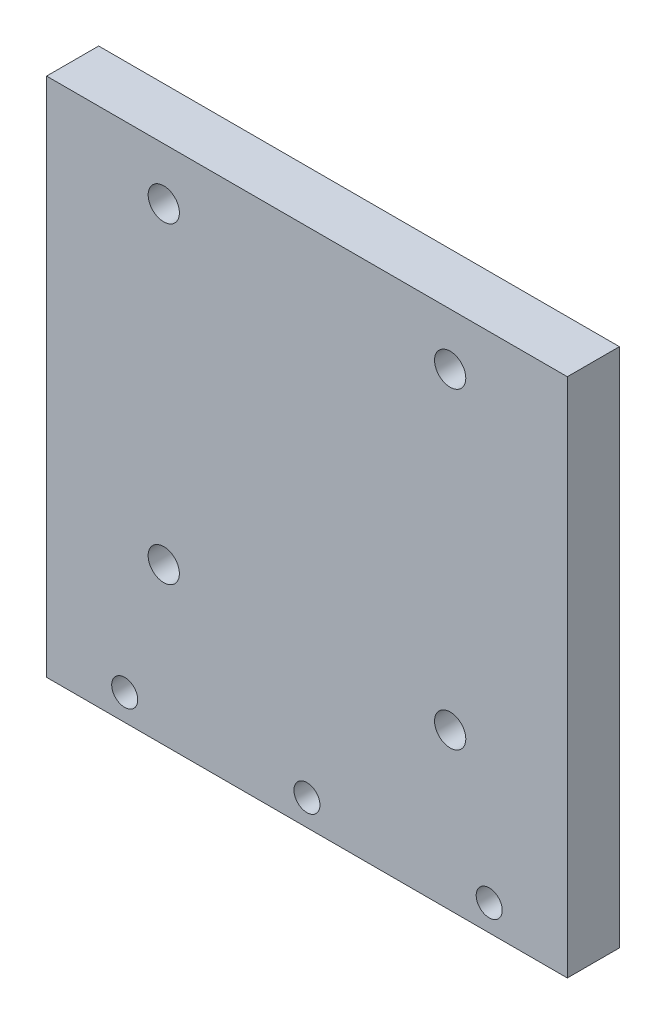
ISO-10303-21;
HEADER;
FILE_DESCRIPTION(('STEP AP214'),'2;1');
FILE_NAME('part.step','',(''),(''),'','','');
FILE_SCHEMA(('AUTOMOTIVE_DESIGN { 1 0 10303 214 1 1 1 1 }'));
ENDSEC;
DATA;
#1=APPLICATION_CONTEXT('core data for automotive mechanical design processes');
#2=APPLICATION_PROTOCOL_DEFINITION('international standard','automotive_design',2000,#1);
#3=PRODUCT_CONTEXT('',#1,'mechanical');
#4=PRODUCT('Part','Part','',(#3));
#5=PRODUCT_RELATED_PRODUCT_CATEGORY('part','',(#4));
#6=PRODUCT_DEFINITION_FORMATION('','',#4);
#7=PRODUCT_DEFINITION_CONTEXT('part definition',#1,'design');
#8=PRODUCT_DEFINITION('design','',#6,#7);
#9=PRODUCT_DEFINITION_SHAPE('','',#8);
#10=(LENGTH_UNIT() NAMED_UNIT(*) SI_UNIT(.MILLI.,.METRE.));
#11=(NAMED_UNIT(*) PLANE_ANGLE_UNIT() SI_UNIT($,.RADIAN.));
#12=(NAMED_UNIT(*) SI_UNIT($,.STERADIAN.) SOLID_ANGLE_UNIT());
#13=UNCERTAINTY_MEASURE_WITH_UNIT(LENGTH_MEASURE(1.E-05),#10,'distance_accuracy_value','');
#14=(GEOMETRIC_REPRESENTATION_CONTEXT(3) GLOBAL_UNCERTAINTY_ASSIGNED_CONTEXT((#13)) GLOBAL_UNIT_ASSIGNED_CONTEXT((#10,
#11,#12)) REPRESENTATION_CONTEXT('',''));
#15=CARTESIAN_POINT('',(0.,0.,0.));
#16=DIRECTION('',(0.,0.,1.));
#17=DIRECTION('',(1.,0.,0.));
#18=AXIS2_PLACEMENT_3D('',#15,#16,#17);
#19=CARTESIAN_POINT('',(0.,0.,10.));
#20=DIRECTION('',(0.,0.,-1.));
#21=DIRECTION('',(-1.,0.,0.));
#22=AXIS2_PLACEMENT_3D('',#19,#20,#21);
#23=PLANE('',#22);
#24=CARTESIAN_POINT('',(35.,-57.0790627287702,10.));
#25=DIRECTION('',(0.,0.,1.));
#26=DIRECTION('',(1.,0.,0.));
#27=AXIS2_PLACEMENT_3D('',#24,#25,#26);
#28=CIRCLE('',#27,2.5);
#29=CARTESIAN_POINT('',(37.5,-57.0790627287702,10.));
#30=VERTEX_POINT('',#29);
#31=EDGE_CURVE('E313',#30,#30,#28,.T.);
#32=ORIENTED_EDGE('',*,*,#31,.F.);
#33=EDGE_LOOP('',(#32));
#34=FACE_BOUND('',#33,.T.);
#35=CARTESIAN_POINT('',(-35.,-57.0790627287702,10.));
#36=DIRECTION('',(0.,0.,1.));
#37=DIRECTION('',(1.,0.,0.));
#38=AXIS2_PLACEMENT_3D('',#35,#36,#37);
#39=CIRCLE('',#38,2.5);
#40=CARTESIAN_POINT('',(-32.5,-57.0790627287702,10.));
#41=VERTEX_POINT('',#40);
#42=EDGE_CURVE('E320',#41,#41,#39,.T.);
#43=ORIENTED_EDGE('',*,*,#42,.F.);
#44=EDGE_LOOP('',(#43));
#45=FACE_BOUND('',#44,.T.);
#46=CARTESIAN_POINT('',(0.,-57.0790627287702,10.));
#47=DIRECTION('',(0.,0.,1.));
#48=DIRECTION('',(1.,0.,0.));
#49=AXIS2_PLACEMENT_3D('',#46,#47,#48);
#50=CIRCLE('',#49,2.5);
#51=CARTESIAN_POINT('',(2.50000000000001,-57.0790627287702,10.));
#52=VERTEX_POINT('',#51);
#53=EDGE_CURVE('E107',#52,#52,#50,.T.);
#54=ORIENTED_EDGE('',*,*,#53,.F.);
#55=EDGE_LOOP('',(#54));
#56=FACE_BOUND('',#55,.T.);
#57=DIRECTION('',(0.,1.,0.));
#58=VECTOR('',#57,1.);
#59=CARTESIAN_POINT('',(50.,-42.0790627287702,10.));
#60=LINE('',#59,#58);
#61=CARTESIAN_POINT('',(50.,-62.0790627287702,10.));
#62=VERTEX_POINT('',#61);
#63=CARTESIAN_POINT('',(50.,37.9209372712298,10.));
#64=VERTEX_POINT('',#63);
#65=EDGE_CURVE('E90',#62,#64,#60,.T.);
#66=ORIENTED_EDGE('',*,*,#65,.T.);
#67=DIRECTION('',(-1.,0.,0.));
#68=VECTOR('',#67,1.);
#69=CARTESIAN_POINT('',(-50.,37.9209372712298,10.));
#70=LINE('',#69,#68);
#71=CARTESIAN_POINT('',(-50.,37.9209372712298,10.));
#72=VERTEX_POINT('',#71);
#73=EDGE_CURVE('E57',#64,#72,#70,.T.);
#74=ORIENTED_EDGE('',*,*,#73,.T.);
#75=DIRECTION('',(0.,-1.,0.));
#76=VECTOR('',#75,1.);
#77=CARTESIAN_POINT('',(-50.,-42.0790627287702,10.));
#78=LINE('',#77,#76);
#79=CARTESIAN_POINT('',(-50.,-62.0790627287702,10.));
#80=VERTEX_POINT('',#79);
#81=EDGE_CURVE('E72',#72,#80,#78,.T.);
#82=ORIENTED_EDGE('',*,*,#81,.T.);
#83=DIRECTION('',(-1.,0.,0.));
#84=VECTOR('',#83,1.);
#85=CARTESIAN_POINT('',(-50.,-62.0790627287702,10.));
#86=LINE('',#85,#84);
#87=EDGE_CURVE('E105',#62,#80,#86,.T.);
#88=ORIENTED_EDGE('',*,*,#87,.F.);
#89=EDGE_LOOP('',(#66,#74,#82,#88));
#90=FACE_BOUND('',#89,.T.);
#91=CARTESIAN_POINT('',(27.5,27.92093727123,10.));
#92=DIRECTION('',(0.,0.,1.));
#93=DIRECTION('',(1.,0.,0.));
#94=AXIS2_PLACEMENT_3D('',#91,#92,#93);
#95=CIRCLE('',#94,3.);
#96=CARTESIAN_POINT('',(30.5,27.92093727123,10.));
#97=VERTEX_POINT('',#96);
#98=EDGE_CURVE('E144',#97,#97,#95,.T.);
#99=ORIENTED_EDGE('',*,*,#98,.F.);
#100=EDGE_LOOP('',(#99));
#101=FACE_BOUND('',#100,.T.);
#102=CARTESIAN_POINT('',(-27.5,-32.07906272877,10.));
#103=DIRECTION('',(0.,0.,1.));
#104=DIRECTION('',(-1.,0.,0.));
#105=AXIS2_PLACEMENT_3D('',#102,#103,#104);
#106=CIRCLE('',#105,3.);
#107=CARTESIAN_POINT('',(-30.5,-32.07906272877,10.));
#108=VERTEX_POINT('',#107);
#109=EDGE_CURVE('E136',#108,#108,#106,.T.);
#110=ORIENTED_EDGE('',*,*,#109,.F.);
#111=EDGE_LOOP('',(#110));
#112=FACE_BOUND('',#111,.T.);
#113=CARTESIAN_POINT('',(-27.5,27.9209372712296,10.));
#114=DIRECTION('',(0.,0.,1.));
#115=DIRECTION('',(1.,0.,0.));
#116=AXIS2_PLACEMENT_3D('',#113,#114,#115);
#117=CIRCLE('',#116,3.);
#118=CARTESIAN_POINT('',(-24.5,27.9209372712296,10.));
#119=VERTEX_POINT('',#118);
#120=EDGE_CURVE('E128',#119,#119,#117,.T.);
#121=ORIENTED_EDGE('',*,*,#120,.F.);
#122=EDGE_LOOP('',(#121));
#123=FACE_BOUND('',#122,.T.);
#124=CARTESIAN_POINT('',(27.5,-32.0790627287704,10.));
#125=DIRECTION('',(0.,0.,1.));
#126=DIRECTION('',(-1.,0.,0.));
#127=AXIS2_PLACEMENT_3D('',#124,#125,#126);
#128=CIRCLE('',#127,3.);
#129=CARTESIAN_POINT('',(24.5,-32.0790627287704,10.));
#130=VERTEX_POINT('',#129);
#131=EDGE_CURVE('E120',#130,#130,#128,.T.);
#132=ORIENTED_EDGE('',*,*,#131,.F.);
#133=EDGE_LOOP('',(#132));
#134=FACE_BOUND('',#133,.T.);
#135=ADVANCED_FACE('F39',(#34,#45,#56,#90,#101,#112,#123,#134),#23,.F.);
#136=CARTESIAN_POINT('',(0.,0.,0.));
#137=DIRECTION('',(0.,0.,-1.));
#138=DIRECTION('',(-1.,0.,0.));
#139=AXIS2_PLACEMENT_3D('',#136,#137,#138);
#140=PLANE('',#139);
#141=CARTESIAN_POINT('',(35.,-57.0790627287702,0.));
#142=DIRECTION('',(0.,0.,-1.));
#143=DIRECTION('',(-1.,0.,0.));
#144=AXIS2_PLACEMENT_3D('',#141,#142,#143);
#145=CIRCLE('',#144,2.5);
#146=CARTESIAN_POINT('',(32.5,-57.0790627287702,0.));
#147=VERTEX_POINT('',#146);
#148=EDGE_CURVE('E310',#147,#147,#145,.F.);
#149=ORIENTED_EDGE('',*,*,#148,.T.);
#150=EDGE_LOOP('',(#149));
#151=FACE_BOUND('',#150,.T.);
#152=CARTESIAN_POINT('',(-35.,-57.0790627287702,0.));
#153=DIRECTION('',(0.,0.,-1.));
#154=DIRECTION('',(-1.,0.,0.));
#155=AXIS2_PLACEMENT_3D('',#152,#153,#154);
#156=CIRCLE('',#155,2.5);
#157=CARTESIAN_POINT('',(-37.5,-57.0790627287702,0.));
#158=VERTEX_POINT('',#157);
#159=EDGE_CURVE('E315',#158,#158,#156,.F.);
#160=ORIENTED_EDGE('',*,*,#159,.T.);
#161=EDGE_LOOP('',(#160));
#162=FACE_BOUND('',#161,.T.);
#163=CARTESIAN_POINT('',(0.,-57.0790627287702,0.));
#164=DIRECTION('',(0.,0.,-1.));
#165=DIRECTION('',(-1.,0.,0.));
#166=AXIS2_PLACEMENT_3D('',#163,#164,#165);
#167=CIRCLE('',#166,2.5);
#168=CARTESIAN_POINT('',(-2.49999999999999,-57.0790627287702,0.));
#169=VERTEX_POINT('',#168);
#170=EDGE_CURVE('E111',#169,#169,#167,.F.);
#171=ORIENTED_EDGE('',*,*,#170,.T.);
#172=EDGE_LOOP('',(#171));
#173=FACE_BOUND('',#172,.T.);
#174=CARTESIAN_POINT('',(-27.5,27.9209372712296,0.));
#175=DIRECTION('',(0.,0.,1.));
#176=DIRECTION('',(1.,0.,0.));
#177=AXIS2_PLACEMENT_3D('',#174,#175,#176);
#178=CIRCLE('',#177,3.);
#179=CARTESIAN_POINT('',(-24.5,27.9209372712296,0.));
#180=VERTEX_POINT('',#179);
#181=EDGE_CURVE('E124',#180,#180,#178,.T.);
#182=ORIENTED_EDGE('',*,*,#181,.T.);
#183=EDGE_LOOP('',(#182));
#184=FACE_BOUND('',#183,.T.);
#185=CARTESIAN_POINT('',(27.5,27.92093727123,0.));
#186=DIRECTION('',(0.,0.,1.));
#187=DIRECTION('',(1.,0.,0.));
#188=AXIS2_PLACEMENT_3D('',#185,#186,#187);
#189=CIRCLE('',#188,3.);
#190=CARTESIAN_POINT('',(30.5,27.92093727123,0.));
#191=VERTEX_POINT('',#190);
#192=EDGE_CURVE('E140',#191,#191,#189,.T.);
#193=ORIENTED_EDGE('',*,*,#192,.T.);
#194=EDGE_LOOP('',(#193));
#195=FACE_BOUND('',#194,.T.);
#196=DIRECTION('',(0.,1.,0.));
#197=VECTOR('',#196,1.);
#198=CARTESIAN_POINT('',(50.,-42.0790627287702,0.));
#199=LINE('',#198,#197);
#200=CARTESIAN_POINT('',(50.,-62.0790627287702,0.));
#201=VERTEX_POINT('',#200);
#202=CARTESIAN_POINT('',(50.,37.9209372712298,0.));
#203=VERTEX_POINT('',#202);
#204=EDGE_CURVE('E97',#201,#203,#199,.T.);
#205=ORIENTED_EDGE('',*,*,#204,.F.);
#206=DIRECTION('',(1.,0.,0.));
#207=VECTOR('',#206,1.);
#208=CARTESIAN_POINT('',(-50.,-62.0790627287702,0.));
#209=LINE('',#208,#207);
#210=CARTESIAN_POINT('',(-50.,-62.0790627287702,0.));
#211=VERTEX_POINT('',#210);
#212=EDGE_CURVE('E93',#211,#201,#209,.T.);
#213=ORIENTED_EDGE('',*,*,#212,.F.);
#214=DIRECTION('',(0.,-1.,0.));
#215=VECTOR('',#214,1.);
#216=CARTESIAN_POINT('',(-50.,-42.0790627287702,0.));
#217=LINE('',#216,#215);
#218=CARTESIAN_POINT('',(-50.,37.9209372712298,0.));
#219=VERTEX_POINT('',#218);
#220=EDGE_CURVE('E84',#219,#211,#217,.T.);
#221=ORIENTED_EDGE('',*,*,#220,.F.);
#222=DIRECTION('',(-1.,0.,0.));
#223=VECTOR('',#222,1.);
#224=CARTESIAN_POINT('',(-50.,37.9209372712298,0.));
#225=LINE('',#224,#223);
#226=EDGE_CURVE('E68',#203,#219,#225,.T.);
#227=ORIENTED_EDGE('',*,*,#226,.F.);
#228=EDGE_LOOP('',(#205,#213,#221,#227));
#229=FACE_BOUND('',#228,.T.);
#230=CARTESIAN_POINT('',(-27.5,-32.07906272877,0.));
#231=DIRECTION('',(0.,0.,1.));
#232=DIRECTION('',(-1.,0.,0.));
#233=AXIS2_PLACEMENT_3D('',#230,#231,#232);
#234=CIRCLE('',#233,3.);
#235=CARTESIAN_POINT('',(-30.5,-32.07906272877,0.));
#236=VERTEX_POINT('',#235);
#237=EDGE_CURVE('E132',#236,#236,#234,.T.);
#238=ORIENTED_EDGE('',*,*,#237,.T.);
#239=EDGE_LOOP('',(#238));
#240=FACE_BOUND('',#239,.T.);
#241=CARTESIAN_POINT('',(27.5,-32.0790627287704,0.));
#242=DIRECTION('',(0.,0.,1.));
#243=DIRECTION('',(-1.,0.,0.));
#244=AXIS2_PLACEMENT_3D('',#241,#242,#243);
#245=CIRCLE('',#244,3.);
#246=CARTESIAN_POINT('',(24.5,-32.0790627287704,0.));
#247=VERTEX_POINT('',#246);
#248=EDGE_CURVE('E119',#247,#247,#245,.T.);
#249=ORIENTED_EDGE('',*,*,#248,.T.);
#250=EDGE_LOOP('',(#249));
#251=FACE_BOUND('',#250,.T.);
#252=ADVANCED_FACE('F94',(#151,#162,#173,#184,#195,#229,#240,#251),#140,.T.);
#253=CARTESIAN_POINT('',(50.,-42.0790627287702,10.));
#254=DIRECTION('',(-1.,0.,0.));
#255=DIRECTION('',(0.,0.,1.));
#256=AXIS2_PLACEMENT_3D('',#253,#254,#255);
#257=PLANE('',#256);
#258=ORIENTED_EDGE('',*,*,#204,.T.);
#259=DIRECTION('',(0.,0.,-1.));
#260=VECTOR('',#259,1.);
#261=CARTESIAN_POINT('',(50.,37.9209372712298,10.));
#262=LINE('',#261,#260);
#263=EDGE_CURVE('E11',#64,#203,#262,.T.);
#264=ORIENTED_EDGE('',*,*,#263,.F.);
#265=ORIENTED_EDGE('',*,*,#65,.F.);
#266=DIRECTION('',(0.,0.,1.));
#267=VECTOR('',#266,1.);
#268=CARTESIAN_POINT('',(50.,-62.0790627287702,10.));
#269=LINE('',#268,#267);
#270=EDGE_CURVE('E102',#201,#62,#269,.T.);
#271=ORIENTED_EDGE('',*,*,#270,.F.);
#272=EDGE_LOOP('',(#258,#264,#265,#271));
#273=FACE_BOUND('',#272,.T.);
#274=ADVANCED_FACE('F41',(#273),#257,.F.);
#275=CARTESIAN_POINT('',(-50.,37.9209372712298,10.));
#276=DIRECTION('',(0.,-1.,0.));
#277=DIRECTION('',(0.,0.,-1.));
#278=AXIS2_PLACEMENT_3D('',#275,#276,#277);
#279=PLANE('',#278);
#280=ORIENTED_EDGE('',*,*,#226,.T.);
#281=DIRECTION('',(0.,0.,-1.));
#282=VECTOR('',#281,1.);
#283=CARTESIAN_POINT('',(-50.,37.9209372712298,10.));
#284=LINE('',#283,#282);
#285=EDGE_CURVE('E49',#72,#219,#284,.T.);
#286=ORIENTED_EDGE('',*,*,#285,.F.);
#287=ORIENTED_EDGE('',*,*,#73,.F.);
#288=ORIENTED_EDGE('',*,*,#263,.T.);
#289=EDGE_LOOP('',(#280,#286,#287,#288));
#290=FACE_BOUND('',#289,.T.);
#291=ADVANCED_FACE('F162',(#290),#279,.F.);
#292=CARTESIAN_POINT('',(-50.,-42.0790627287702,10.));
#293=DIRECTION('',(1.,0.,0.));
#294=DIRECTION('',(0.,0.,-1.));
#295=AXIS2_PLACEMENT_3D('',#292,#293,#294);
#296=PLANE('',#295);
#297=ORIENTED_EDGE('',*,*,#220,.T.);
#298=DIRECTION('',(0.,0.,-1.));
#299=VECTOR('',#298,1.);
#300=CARTESIAN_POINT('',(-50.,-62.0790627287702,10.));
#301=LINE('',#300,#299);
#302=EDGE_CURVE('E88',#80,#211,#301,.T.);
#303=ORIENTED_EDGE('',*,*,#302,.F.);
#304=ORIENTED_EDGE('',*,*,#81,.F.);
#305=ORIENTED_EDGE('',*,*,#285,.T.);
#306=EDGE_LOOP('',(#297,#303,#304,#305));
#307=FACE_BOUND('',#306,.T.);
#308=ADVANCED_FACE('F86',(#307),#296,.F.);
#309=CARTESIAN_POINT('',(27.5,27.92093727123,10.));
#310=DIRECTION('',(0.,0.,-1.));
#311=DIRECTION('',(-1.,0.,0.));
#312=AXIS2_PLACEMENT_3D('',#309,#310,#311);
#313=CYLINDRICAL_SURFACE('',#312,3.);
#314=ORIENTED_EDGE('',*,*,#98,.T.);
#315=EDGE_LOOP('',(#314));
#316=FACE_BOUND('',#315,.T.);
#317=ORIENTED_EDGE('',*,*,#192,.F.);
#318=EDGE_LOOP('',(#317));
#319=FACE_BOUND('',#318,.T.);
#320=ADVANCED_FACE('F195',(#316,#319),#313,.F.);
#321=CARTESIAN_POINT('',(-27.5,-32.07906272877,10.));
#322=DIRECTION('',(0.,0.,-1.));
#323=DIRECTION('',(-1.,0.,0.));
#324=AXIS2_PLACEMENT_3D('',#321,#322,#323);
#325=CYLINDRICAL_SURFACE('',#324,3.);
#326=ORIENTED_EDGE('',*,*,#109,.T.);
#327=EDGE_LOOP('',(#326));
#328=FACE_BOUND('',#327,.T.);
#329=ORIENTED_EDGE('',*,*,#237,.F.);
#330=EDGE_LOOP('',(#329));
#331=FACE_BOUND('',#330,.T.);
#332=ADVANCED_FACE('F212',(#328,#331),#325,.F.);
#333=CARTESIAN_POINT('',(-27.5,27.9209372712296,10.));
#334=DIRECTION('',(0.,0.,-1.));
#335=DIRECTION('',(-1.,0.,0.));
#336=AXIS2_PLACEMENT_3D('',#333,#334,#335);
#337=CYLINDRICAL_SURFACE('',#336,3.);
#338=ORIENTED_EDGE('',*,*,#120,.T.);
#339=EDGE_LOOP('',(#338));
#340=FACE_BOUND('',#339,.T.);
#341=ORIENTED_EDGE('',*,*,#181,.F.);
#342=EDGE_LOOP('',(#341));
#343=FACE_BOUND('',#342,.T.);
#344=ADVANCED_FACE('F180',(#340,#343),#337,.F.);
#345=CARTESIAN_POINT('',(27.5,-32.0790627287704,10.));
#346=DIRECTION('',(0.,0.,-1.));
#347=DIRECTION('',(-1.,0.,0.));
#348=AXIS2_PLACEMENT_3D('',#345,#346,#347);
#349=CYLINDRICAL_SURFACE('',#348,3.);
#350=ORIENTED_EDGE('',*,*,#131,.T.);
#351=EDGE_LOOP('',(#350));
#352=FACE_BOUND('',#351,.T.);
#353=ORIENTED_EDGE('',*,*,#248,.F.);
#354=EDGE_LOOP('',(#353));
#355=FACE_BOUND('',#354,.T.);
#356=ADVANCED_FACE('F177',(#352,#355),#349,.F.);
#357=CARTESIAN_POINT('',(0.,-62.0790627287702,0.));
#358=DIRECTION('',(0.,-1.,0.));
#359=DIRECTION('',(0.,0.,-1.));
#360=AXIS2_PLACEMENT_3D('',#357,#358,#359);
#361=PLANE('',#360);
#362=ORIENTED_EDGE('',*,*,#302,.T.);
#363=ORIENTED_EDGE('',*,*,#212,.T.);
#364=ORIENTED_EDGE('',*,*,#270,.T.);
#365=ORIENTED_EDGE('',*,*,#87,.T.);
#366=EDGE_LOOP('',(#362,#363,#364,#365));
#367=FACE_BOUND('',#366,.T.);
#368=ADVANCED_FACE('F104',(#367),#361,.T.);
#369=CARTESIAN_POINT('',(0.,-57.0790627287702,-0.000999999999999265));
#370=DIRECTION('',(0.,0.,1.));
#371=DIRECTION('',(1.,0.,0.));
#372=AXIS2_PLACEMENT_3D('',#369,#370,#371);
#373=CYLINDRICAL_SURFACE('',#372,2.5);
#374=ORIENTED_EDGE('',*,*,#170,.F.);
#375=EDGE_LOOP('',(#374));
#376=FACE_BOUND('',#375,.T.);
#377=ORIENTED_EDGE('',*,*,#53,.T.);
#378=EDGE_LOOP('',(#377));
#379=FACE_BOUND('',#378,.T.);
#380=ADVANCED_FACE('F236',(#376,#379),#373,.F.);
#381=CARTESIAN_POINT('',(-35.,-57.0790627287702,-0.000999999999999265));
#382=DIRECTION('',(0.,0.,1.));
#383=DIRECTION('',(1.,0.,0.));
#384=AXIS2_PLACEMENT_3D('',#381,#382,#383);
#385=CYLINDRICAL_SURFACE('',#384,2.5);
#386=ORIENTED_EDGE('',*,*,#159,.F.);
#387=EDGE_LOOP('',(#386));
#388=FACE_BOUND('',#387,.T.);
#389=ORIENTED_EDGE('',*,*,#42,.T.);
#390=EDGE_LOOP('',(#389));
#391=FACE_BOUND('',#390,.T.);
#392=ADVANCED_FACE('F244',(#388,#391),#385,.F.);
#393=CARTESIAN_POINT('',(35.,-57.0790627287702,-0.000999999999999265));
#394=DIRECTION('',(0.,0.,1.));
#395=DIRECTION('',(1.,0.,0.));
#396=AXIS2_PLACEMENT_3D('',#393,#394,#395);
#397=CYLINDRICAL_SURFACE('',#396,2.5);
#398=ORIENTED_EDGE('',*,*,#148,.F.);
#399=EDGE_LOOP('',(#398));
#400=FACE_BOUND('',#399,.T.);
#401=ORIENTED_EDGE('',*,*,#31,.T.);
#402=EDGE_LOOP('',(#401));
#403=FACE_BOUND('',#402,.T.);
#404=ADVANCED_FACE('F252',(#400,#403),#397,.F.);
#405=CLOSED_SHELL('',(#135,#252,#274,#291,#308,#320,#332,#344,#356,#368,#380,#392,#404));
#406=MANIFOLD_SOLID_BREP('B2',#405);
#407=ADVANCED_BREP_SHAPE_REPRESENTATION('',(#18,#406),#14);
#408=SHAPE_DEFINITION_REPRESENTATION(#9,#407);
ENDSEC;
END-ISO-10303-21;
